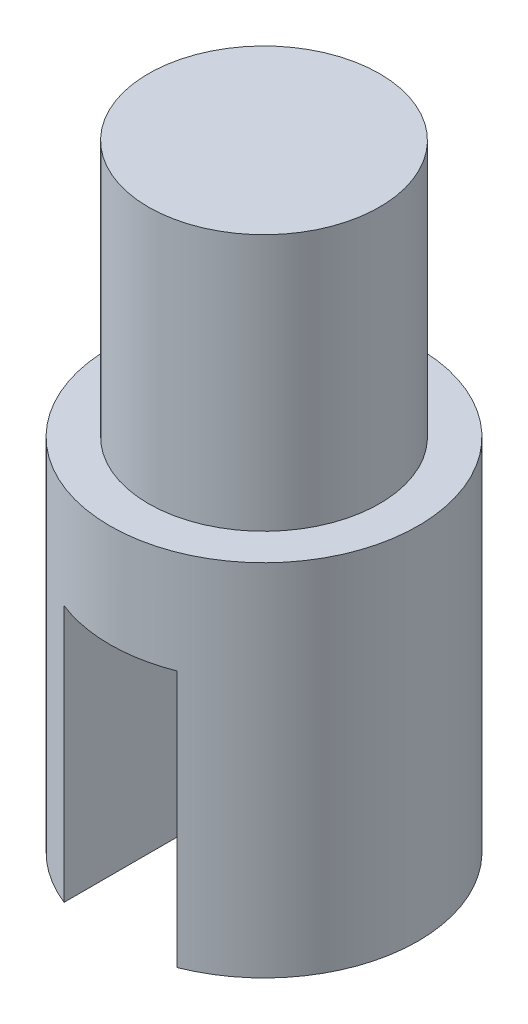
ISO-10303-21;
HEADER;
FILE_DESCRIPTION(('STEP AP214'),'2;1');
FILE_NAME('part.step','',(''),(''),'','','');
FILE_SCHEMA(('AUTOMOTIVE_DESIGN { 1 0 10303 214 1 1 1 1 }'));
ENDSEC;
DATA;
#1=APPLICATION_CONTEXT('core data for automotive mechanical design processes');
#2=APPLICATION_PROTOCOL_DEFINITION('international standard','automotive_design',2000,#1);
#3=PRODUCT_CONTEXT('',#1,'mechanical');
#4=PRODUCT('Part','Part','',(#3));
#5=PRODUCT_RELATED_PRODUCT_CATEGORY('part','',(#4));
#6=PRODUCT_DEFINITION_FORMATION('','',#4);
#7=PRODUCT_DEFINITION_CONTEXT('part definition',#1,'design');
#8=PRODUCT_DEFINITION('design','',#6,#7);
#9=PRODUCT_DEFINITION_SHAPE('','',#8);
#10=(LENGTH_UNIT() NAMED_UNIT(*) SI_UNIT(.MILLI.,.METRE.));
#11=(NAMED_UNIT(*) PLANE_ANGLE_UNIT() SI_UNIT($,.RADIAN.));
#12=(NAMED_UNIT(*) SI_UNIT($,.STERADIAN.) SOLID_ANGLE_UNIT());
#13=UNCERTAINTY_MEASURE_WITH_UNIT(LENGTH_MEASURE(1.E-05),#10,'distance_accuracy_value','');
#14=(GEOMETRIC_REPRESENTATION_CONTEXT(3) GLOBAL_UNCERTAINTY_ASSIGNED_CONTEXT((#13)) GLOBAL_UNIT_ASSIGNED_CONTEXT((#10,
#11,#12)) REPRESENTATION_CONTEXT('',''));
#15=CARTESIAN_POINT('',(0.,0.,0.));
#16=DIRECTION('',(0.,0.,1.));
#17=DIRECTION('',(1.,0.,0.));
#18=AXIS2_PLACEMENT_3D('',#15,#16,#17);
#19=CARTESIAN_POINT('',(0.,13.,0.));
#20=DIRECTION('',(0.,1.,0.));
#21=DIRECTION('',(0.,0.,1.));
#22=AXIS2_PLACEMENT_3D('',#19,#20,#21);
#23=PLANE('',#22);
#24=CARTESIAN_POINT('',(0.,13.,0.));
#25=DIRECTION('',(0.,1.,0.));
#26=DIRECTION('',(0.,0.,1.));
#27=AXIS2_PLACEMENT_3D('',#24,#25,#26);
#28=CIRCLE('',#27,2.25);
#29=CARTESIAN_POINT('',(0.,13.,2.25));
#30=VERTEX_POINT('',#29);
#31=EDGE_CURVE('E20',#30,#30,#28,.F.);
#32=ORIENTED_EDGE('',*,*,#31,.F.);
#33=EDGE_LOOP('',(#32));
#34=FACE_BOUND('',#33,.T.);
#35=ADVANCED_FACE('F17',(#34),#23,.T.);
#36=CARTESIAN_POINT('',(0.,13.,0.));
#37=DIRECTION('',(0.,1.,0.));
#38=DIRECTION('',(0.,0.,1.));
#39=AXIS2_PLACEMENT_3D('',#36,#37,#38);
#40=CYLINDRICAL_SURFACE('',#39,2.25);
#41=CARTESIAN_POINT('',(0.,8.,0.));
#42=DIRECTION('',(0.,1.,0.));
#43=DIRECTION('',(0.,0.,1.));
#44=AXIS2_PLACEMENT_3D('',#41,#42,#43);
#45=CIRCLE('',#44,2.25);
#46=CARTESIAN_POINT('',(0.,8.,2.25));
#47=VERTEX_POINT('',#46);
#48=EDGE_CURVE('E80',#47,#47,#45,.F.);
#49=ORIENTED_EDGE('',*,*,#48,.F.);
#50=EDGE_LOOP('',(#49));
#51=FACE_BOUND('',#50,.T.);
#52=ORIENTED_EDGE('',*,*,#31,.T.);
#53=EDGE_LOOP('',(#52));
#54=FACE_BOUND('',#53,.T.);
#55=ADVANCED_FACE('F154',(#51,#54),#40,.T.);
#56=CARTESIAN_POINT('',(1.1,0.,-3.301789687104));
#57=DIRECTION('',(1.,0.,0.));
#58=DIRECTION('',(0.,0.,-1.));
#59=AXIS2_PLACEMENT_3D('',#56,#57,#58);
#60=PLANE('',#59);
#61=DIRECTION('',(0.,0.,-1.));
#62=VECTOR('',#61,1.);
#63=CARTESIAN_POINT('',(1.1,6.,0.));
#64=LINE('',#63,#62);
#65=CARTESIAN_POINT('',(1.09999999999993,6.,-2.7910571473906));
#66=VERTEX_POINT('',#65);
#67=CARTESIAN_POINT('',(1.09999999999993,6.,2.7910571473906));
#68=VERTEX_POINT('',#67);
#69=EDGE_CURVE('E57',#66,#68,#64,.F.);
#70=ORIENTED_EDGE('',*,*,#69,.F.);
#71=DIRECTION('',(0.,1.,0.));
#72=VECTOR('',#71,1.);
#73=CARTESIAN_POINT('',(1.09999999999985,0.,-2.79105714739063));
#74=LINE('',#73,#72);
#75=CARTESIAN_POINT('',(1.09999999999993,1.,-2.7910571473906));
#76=VERTEX_POINT('',#75);
#77=EDGE_CURVE('E92',#76,#66,#74,.T.);
#78=ORIENTED_EDGE('',*,*,#77,.F.);
#79=DIRECTION('',(0.,0.,-1.));
#80=VECTOR('',#79,1.);
#81=CARTESIAN_POINT('',(1.1,1.,0.));
#82=LINE('',#81,#80);
#83=CARTESIAN_POINT('',(1.09999999999993,1.,2.7910571473906));
#84=VERTEX_POINT('',#83);
#85=EDGE_CURVE('E74',#84,#76,#82,.T.);
#86=ORIENTED_EDGE('',*,*,#85,.F.);
#87=DIRECTION('',(0.,1.,0.));
#88=VECTOR('',#87,1.);
#89=CARTESIAN_POINT('',(1.09999999999985,0.,2.79105714739063));
#90=LINE('',#89,#88);
#91=EDGE_CURVE('E71',#68,#84,#90,.F.);
#92=ORIENTED_EDGE('',*,*,#91,.F.);
#93=EDGE_LOOP('',(#70,#78,#86,#92));
#94=FACE_BOUND('',#93,.T.);
#95=ADVANCED_FACE('F72',(#94),#60,.F.);
#96=CARTESIAN_POINT('',(0.,6.,0.));
#97=DIRECTION('',(0.,-1.,0.));
#98=DIRECTION('',(0.,0.,-1.));
#99=AXIS2_PLACEMENT_3D('',#96,#97,#98);
#100=PLANE('',#99);
#101=DIRECTION('',(0.,0.,1.));
#102=VECTOR('',#101,1.);
#103=CARTESIAN_POINT('',(-1.1,6.,4.0885499104));
#104=LINE('',#103,#102);
#105=CARTESIAN_POINT('',(-1.09999999999993,6.,2.7910571473906));
#106=VERTEX_POINT('',#105);
#107=CARTESIAN_POINT('',(-1.09999999999993,6.,-2.7910571473906));
#108=VERTEX_POINT('',#107);
#109=EDGE_CURVE('E52',#106,#108,#104,.F.);
#110=ORIENTED_EDGE('',*,*,#109,.T.);
#111=CARTESIAN_POINT('',(0.,6.,0.));
#112=DIRECTION('',(0.,1.,0.));
#113=DIRECTION('',(0.,0.,1.));
#114=AXIS2_PLACEMENT_3D('',#111,#112,#113);
#115=CIRCLE('',#114,3.);
#116=EDGE_CURVE('E64',#66,#108,#115,.T.);
#117=ORIENTED_EDGE('',*,*,#116,.F.);
#118=ORIENTED_EDGE('',*,*,#69,.T.);
#119=CARTESIAN_POINT('',(0.,6.,0.));
#120=DIRECTION('',(0.,1.,0.));
#121=DIRECTION('',(0.,0.,1.));
#122=AXIS2_PLACEMENT_3D('',#119,#120,#121);
#123=CIRCLE('',#122,3.);
#124=EDGE_CURVE('E61',#106,#68,#123,.T.);
#125=ORIENTED_EDGE('',*,*,#124,.F.);
#126=EDGE_LOOP('',(#110,#117,#118,#125));
#127=FACE_BOUND('',#126,.T.);
#128=ADVANCED_FACE('F59',(#127),#100,.T.);
#129=CARTESIAN_POINT('',(-1.1,0.,4.0885499104));
#130=DIRECTION('',(-1.,0.,0.));
#131=DIRECTION('',(0.,0.,1.));
#132=AXIS2_PLACEMENT_3D('',#129,#130,#131);
#133=PLANE('',#132);
#134=ORIENTED_EDGE('',*,*,#109,.F.);
#135=DIRECTION('',(0.,1.,0.));
#136=VECTOR('',#135,1.);
#137=CARTESIAN_POINT('',(-1.09999999999985,0.,2.79105714739063));
#138=LINE('',#137,#136);
#139=CARTESIAN_POINT('',(-1.09999999999993,1.,2.7910571473906));
#140=VERTEX_POINT('',#139);
#141=EDGE_CURVE('E78',#140,#106,#138,.T.);
#142=ORIENTED_EDGE('',*,*,#141,.F.);
#143=DIRECTION('',(0.,0.,-1.));
#144=VECTOR('',#143,1.);
#145=CARTESIAN_POINT('',(-1.1,1.,0.));
#146=LINE('',#145,#144);
#147=CARTESIAN_POINT('',(-1.09999999999993,1.,-2.7910571473906));
#148=VERTEX_POINT('',#147);
#149=EDGE_CURVE('E35',#148,#140,#146,.F.);
#150=ORIENTED_EDGE('',*,*,#149,.F.);
#151=DIRECTION('',(0.,1.,0.));
#152=VECTOR('',#151,1.);
#153=CARTESIAN_POINT('',(-1.09999999999985,0.,-2.79105714739063));
#154=LINE('',#153,#152);
#155=EDGE_CURVE('E94',#108,#148,#154,.F.);
#156=ORIENTED_EDGE('',*,*,#155,.F.);
#157=EDGE_LOOP('',(#134,#142,#150,#156));
#158=FACE_BOUND('',#157,.T.);
#159=ADVANCED_FACE('F99',(#158),#133,.F.);
#160=CARTESIAN_POINT('',(0.,1.,0.));
#161=DIRECTION('',(0.,-1.,0.));
#162=DIRECTION('',(0.,0.,-1.));
#163=AXIS2_PLACEMENT_3D('',#160,#161,#162);
#164=PLANE('',#163);
#165=ORIENTED_EDGE('',*,*,#149,.T.);
#166=CARTESIAN_POINT('',(0.,1.,0.));
#167=DIRECTION('',(0.,1.,0.));
#168=DIRECTION('',(0.,0.,1.));
#169=AXIS2_PLACEMENT_3D('',#166,#167,#168);
#170=CIRCLE('',#169,3.);
#171=EDGE_CURVE('E96',#148,#140,#170,.T.);
#172=ORIENTED_EDGE('',*,*,#171,.F.);
#173=EDGE_LOOP('',(#165,#172));
#174=FACE_BOUND('',#173,.T.);
#175=ADVANCED_FACE('F101',(#174),#164,.T.);
#176=CARTESIAN_POINT('',(0.,8.,0.));
#177=DIRECTION('',(0.,1.,0.));
#178=DIRECTION('',(0.,0.,1.));
#179=AXIS2_PLACEMENT_3D('',#176,#177,#178);
#180=PLANE('',#179);
#181=ORIENTED_EDGE('',*,*,#48,.T.);
#182=EDGE_LOOP('',(#181));
#183=FACE_BOUND('',#182,.T.);
#184=CARTESIAN_POINT('',(0.,8.,0.));
#185=DIRECTION('',(0.,1.,0.));
#186=DIRECTION('',(0.,0.,1.));
#187=AXIS2_PLACEMENT_3D('',#184,#185,#186);
#188=CIRCLE('',#187,3.);
#189=CARTESIAN_POINT('',(0.,8.,3.));
#190=VERTEX_POINT('',#189);
#191=EDGE_CURVE('E26',#190,#190,#188,.F.);
#192=ORIENTED_EDGE('',*,*,#191,.F.);
#193=EDGE_LOOP('',(#192));
#194=FACE_BOUND('',#193,.T.);
#195=ADVANCED_FACE('F108',(#183,#194),#180,.T.);
#196=CARTESIAN_POINT('',(0.,1.,0.));
#197=DIRECTION('',(0.,-1.,0.));
#198=DIRECTION('',(0.,0.,-1.));
#199=AXIS2_PLACEMENT_3D('',#196,#197,#198);
#200=PLANE('',#199);
#201=ORIENTED_EDGE('',*,*,#85,.T.);
#202=CARTESIAN_POINT('',(0.,1.,0.));
#203=DIRECTION('',(0.,1.,0.));
#204=DIRECTION('',(0.,0.,1.));
#205=AXIS2_PLACEMENT_3D('',#202,#203,#204);
#206=CIRCLE('',#205,3.);
#207=EDGE_CURVE('E11',#84,#76,#206,.T.);
#208=ORIENTED_EDGE('',*,*,#207,.F.);
#209=EDGE_LOOP('',(#201,#208));
#210=FACE_BOUND('',#209,.T.);
#211=ADVANCED_FACE('F112',(#210),#200,.T.);
#212=CARTESIAN_POINT('',(0.,0.,0.));
#213=DIRECTION('',(0.,1.,0.));
#214=DIRECTION('',(0.,0.,1.));
#215=AXIS2_PLACEMENT_3D('',#212,#213,#214);
#216=CYLINDRICAL_SURFACE('',#215,3.);
#217=ORIENTED_EDGE('',*,*,#191,.T.);
#218=EDGE_LOOP('',(#217));
#219=FACE_BOUND('',#218,.T.);
#220=ORIENTED_EDGE('',*,*,#171,.T.);
#221=ORIENTED_EDGE('',*,*,#141,.T.);
#222=ORIENTED_EDGE('',*,*,#124,.T.);
#223=ORIENTED_EDGE('',*,*,#91,.T.);
#224=ORIENTED_EDGE('',*,*,#207,.T.);
#225=ORIENTED_EDGE('',*,*,#77,.T.);
#226=ORIENTED_EDGE('',*,*,#116,.T.);
#227=ORIENTED_EDGE('',*,*,#155,.T.);
#228=EDGE_LOOP('',(#220,#221,#222,#223,#224,#225,#226,#227));
#229=FACE_BOUND('',#228,.T.);
#230=ADVANCED_FACE('F77',(#219,#229),#216,.T.);
#231=CLOSED_SHELL('',(#35,#55,#95,#128,#159,#175,#195,#211,#230));
#232=MANIFOLD_SOLID_BREP('B1',#231);
#233=ADVANCED_BREP_SHAPE_REPRESENTATION('',(#18,#232),#14);
#234=SHAPE_DEFINITION_REPRESENTATION(#9,#233);
ENDSEC;
END-ISO-10303-21;
